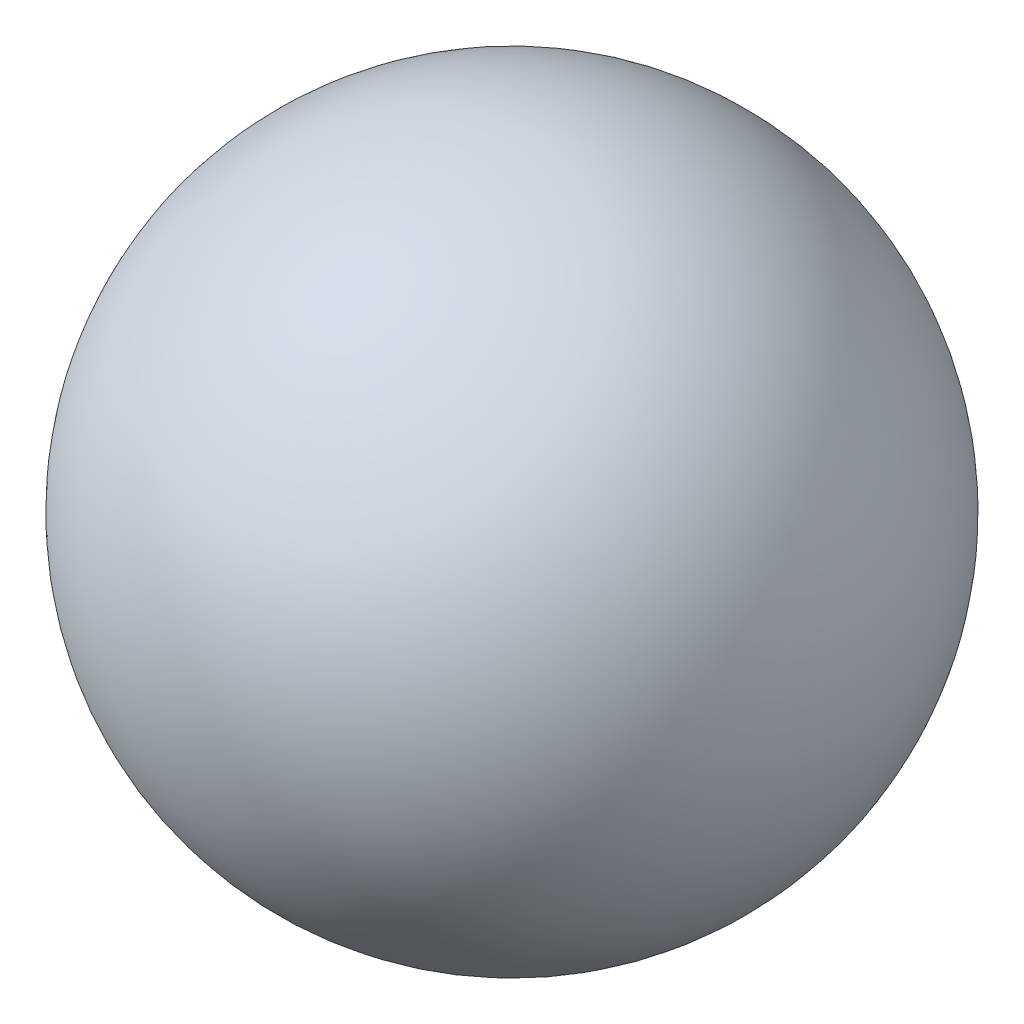
ISO-10303-21;
HEADER;
FILE_DESCRIPTION(('STEP AP214'),'2;1');
FILE_NAME('part.step','',(''),(''),'','','');
FILE_SCHEMA(('AUTOMOTIVE_DESIGN { 1 0 10303 214 1 1 1 1 }'));
ENDSEC;
DATA;
#1=APPLICATION_CONTEXT('core data for automotive mechanical design processes');
#2=APPLICATION_PROTOCOL_DEFINITION('international standard','automotive_design',2000,#1);
#3=PRODUCT_CONTEXT('',#1,'mechanical');
#4=PRODUCT('Part','Part','',(#3));
#5=PRODUCT_RELATED_PRODUCT_CATEGORY('part','',(#4));
#6=PRODUCT_DEFINITION_FORMATION('','',#4);
#7=PRODUCT_DEFINITION_CONTEXT('part definition',#1,'design');
#8=PRODUCT_DEFINITION('design','',#6,#7);
#9=PRODUCT_DEFINITION_SHAPE('','',#8);
#10=(LENGTH_UNIT() NAMED_UNIT(*) SI_UNIT(.MILLI.,.METRE.));
#11=(NAMED_UNIT(*) PLANE_ANGLE_UNIT() SI_UNIT($,.RADIAN.));
#12=(NAMED_UNIT(*) SI_UNIT($,.STERADIAN.) SOLID_ANGLE_UNIT());
#13=UNCERTAINTY_MEASURE_WITH_UNIT(LENGTH_MEASURE(1.E-05),#10,'distance_accuracy_value','');
#14=(GEOMETRIC_REPRESENTATION_CONTEXT(3) GLOBAL_UNCERTAINTY_ASSIGNED_CONTEXT((#13)) GLOBAL_UNIT_ASSIGNED_CONTEXT((#10,
#11,#12)) REPRESENTATION_CONTEXT('',''));
#15=CARTESIAN_POINT('',(0.,0.,0.));
#16=DIRECTION('',(0.,0.,1.));
#17=DIRECTION('',(1.,0.,0.));
#18=AXIS2_PLACEMENT_3D('',#15,#16,#17);
#19=CARTESIAN_POINT('',(0.,0.,0.));
#20=DIRECTION('',(-1.,0.,0.));
#21=DIRECTION('',(0.,1.,0.));
#22=AXIS2_PLACEMENT_3D('',#19,#20,#21);
#23=SPHERICAL_SURFACE('',#22,3.6923076925);
#24=CARTESIAN_POINT('',(-3.6923076925,0.,0.));
#25=VERTEX_POINT('',#24);
#26=VERTEX_LOOP('',#25);
#27=FACE_BOUND('',#26,.T.);
#28=ADVANCED_FACE('F39',(#27),#23,.T.);
#29=CLOSED_SHELL('',(#28));
#30=MANIFOLD_SOLID_BREP('B2',#29);
#31=ADVANCED_BREP_SHAPE_REPRESENTATION('',(#18,#30),#14);
#32=SHAPE_DEFINITION_REPRESENTATION(#9,#31);
ENDSEC;
END-ISO-10303-21;
